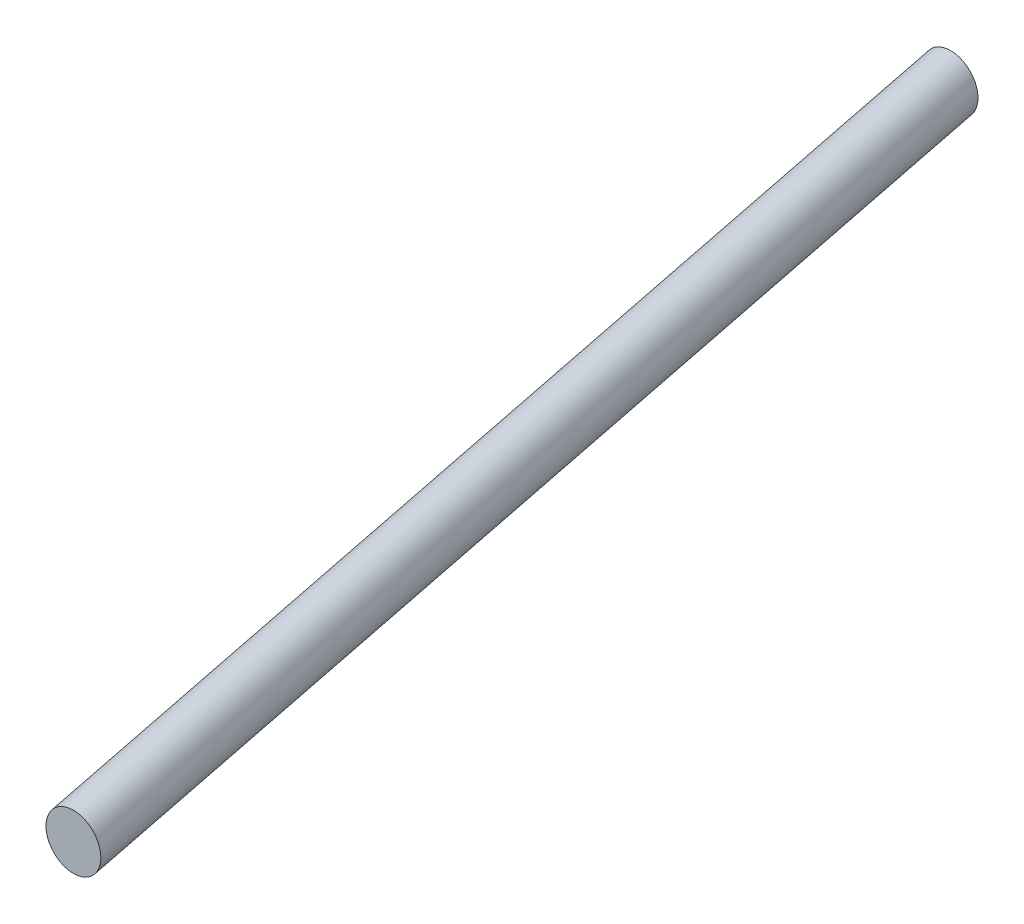
ISO-10303-21;
HEADER;
FILE_DESCRIPTION(('STEP AP214'),'2;1');
FILE_NAME('part.step','',(''),(''),'','','');
FILE_SCHEMA(('AUTOMOTIVE_DESIGN { 1 0 10303 214 1 1 1 1 }'));
ENDSEC;
DATA;
#1=APPLICATION_CONTEXT('core data for automotive mechanical design processes');
#2=APPLICATION_PROTOCOL_DEFINITION('international standard','automotive_design',2000,#1);
#3=PRODUCT_CONTEXT('',#1,'mechanical');
#4=PRODUCT('Part','Part','',(#3));
#5=PRODUCT_RELATED_PRODUCT_CATEGORY('part','',(#4));
#6=PRODUCT_DEFINITION_FORMATION('','',#4);
#7=PRODUCT_DEFINITION_CONTEXT('part definition',#1,'design');
#8=PRODUCT_DEFINITION('design','',#6,#7);
#9=PRODUCT_DEFINITION_SHAPE('','',#8);
#10=(LENGTH_UNIT() NAMED_UNIT(*) SI_UNIT(.MILLI.,.METRE.));
#11=(NAMED_UNIT(*) PLANE_ANGLE_UNIT() SI_UNIT($,.RADIAN.));
#12=(NAMED_UNIT(*) SI_UNIT($,.STERADIAN.) SOLID_ANGLE_UNIT());
#13=UNCERTAINTY_MEASURE_WITH_UNIT(LENGTH_MEASURE(1.E-05),#10,'distance_accuracy_value','');
#14=(GEOMETRIC_REPRESENTATION_CONTEXT(3) GLOBAL_UNCERTAINTY_ASSIGNED_CONTEXT((#13)) GLOBAL_UNIT_ASSIGNED_CONTEXT((#10,
#11,#12)) REPRESENTATION_CONTEXT('',''));
#15=CARTESIAN_POINT('',(0.,0.,0.));
#16=DIRECTION('',(0.,0.,1.));
#17=DIRECTION('',(1.,0.,0.));
#18=AXIS2_PLACEMENT_3D('',#15,#16,#17);
#19=CARTESIAN_POINT('',(20.,0.,100.));
#20=DIRECTION('',(0.,0.,1.));
#21=DIRECTION('',(1.,0.,0.));
#22=AXIS2_PLACEMENT_3D('',#19,#20,#21);
#23=PLANE('',#22);
#24=CARTESIAN_POINT('',(20.,0.,100.));
#25=DIRECTION('',(0.,0.,1.));
#26=DIRECTION('',(1.,0.,0.));
#27=AXIS2_PLACEMENT_3D('',#24,#25,#26);
#28=CIRCLE('',#27,2.5);
#29=CARTESIAN_POINT('',(20.0235615960829,2.49988896777237,100.));
#30=VERTEX_POINT('',#29);
#31=EDGE_CURVE('E11',#30,#30,#28,.T.);
#32=ORIENTED_EDGE('',*,*,#31,.T.);
#33=EDGE_LOOP('',(#32));
#34=FACE_BOUND('',#33,.T.);
#35=ADVANCED_FACE('F55',(#34),#23,.T.);
#36=CARTESIAN_POINT('',(0.,0.,0.));
#37=DIRECTION('',(0.,0.,1.));
#38=DIRECTION('',(1.,0.,0.));
#39=AXIS2_PLACEMENT_3D('',#36,#37,#38);
#40=PLANE('',#39);
#41=CARTESIAN_POINT('',(0.,0.,0.));
#42=DIRECTION('',(0.,0.,1.));
#43=DIRECTION('',(1.,0.,0.));
#44=AXIS2_PLACEMENT_3D('',#41,#42,#43);
#45=CIRCLE('',#44,2.5);
#46=CARTESIAN_POINT('',(-0.0298444213073158,2.49982185575629,0.));
#47=VERTEX_POINT('',#46);
#48=EDGE_CURVE('E64',#47,#47,#45,.T.);
#49=ORIENTED_EDGE('',*,*,#48,.F.);
#50=EDGE_LOOP('',(#49));
#51=FACE_BOUND('',#50,.T.);
#52=ADVANCED_FACE('F88',(#51),#40,.F.);
#53=CARTESIAN_POINT('',(-0.0298444213073158,2.49982185575629,0.));
#54=CARTESIAN_POINT('',(20.0235615960829,2.49988896777237,100.));
#55=CARTESIAN_POINT('',(-0.238162909287007,2.49733482064735,0.));
#56=CARTESIAN_POINT('',(19.8152375154352,2.50185243411261,100.));
#57=CARTESIAN_POINT('',(-0.473510359420386,2.46918995839378,0.));
#58=CARTESIAN_POINT('',(19.5793425578995,2.47874129902993,100.));
#59=CARTESIAN_POINT('',(-0.983691168713184,2.3137551287262,0.));
#60=CARTESIAN_POINT('',(19.065957884627,2.33424001289943,100.));
#61=CARTESIAN_POINT('',(-1.25950853959021,2.1851199852206,0.));
#62=CARTESIAN_POINT('',(18.7874556471185,2.2115260123739,100.));
#63=CARTESIAN_POINT('',(-1.78802876140905,1.77878167842069,0.));
#64=CARTESIAN_POINT('',(18.2503761452872,1.81657025136133,100.));
#65=CARTESIAN_POINT('',(-2.03936906036381,1.49825259573575,0.));
#66=CARTESIAN_POINT('',(17.993100757005,1.54147411053968,100.));
#67=CARTESIAN_POINT('',(-2.30996987041835,0.975953866229826,0.));
#68=CARTESIAN_POINT('',(17.7114047613867,1.0250749167968,100.));
#69=CARTESIAN_POINT('',(-2.38213450682833,0.785819808809174,0.));
#70=CARTESIAN_POINT('',(17.6351950986427,0.83652576711993,100.));
#71=CARTESIAN_POINT('',(-2.47836665174286,0.387009457336666,0.));
#72=CARTESIAN_POINT('',(17.5304658419009,0.439862049420941,100.));
#73=CARTESIAN_POINT('',(-2.50230889086523,0.178474066672376,0.));
#74=CARTESIAN_POINT('',(17.5020744985679,0.231885676730561,100.));
#75=CARTESIAN_POINT('',(-2.49733482064735,-0.238162909287006,0.));
#76=CARTESIAN_POINT('',(17.4981475658874,-0.184762484564835,100.));
#77=CARTESIAN_POINT('',(-2.46842086589654,-0.446067269978093,0.));
#78=CARTESIAN_POINT('',(17.522613835443,-0.393237043271011,100.));
#79=CARTESIAN_POINT('',(-2.36269501631052,-0.842466521851492,0.));
#80=CARTESIAN_POINT('',(17.6198479951113,-0.791804277687069,100.));
#81=CARTESIAN_POINT('',(-2.28601171905746,-1.03082354046727,0.));
#82=CARTESIAN_POINT('',(17.6924902621091,-0.981756365290363,100.));
#83=CARTESIAN_POINT('',(-2.00301876174729,-1.54651312477018,0.));
#84=CARTESIAN_POINT('',(17.9644028960321,-1.5033733519374,100.));
#85=CARTESIAN_POINT('',(-1.74505279472651,-1.82096179386837,0.));
#86=CARTESIAN_POINT('',(18.2164474469279,-1.78326986223089,100.));
#87=CARTESIAN_POINT('',(-1.20698235808933,-2.21456648091048,0.));
#88=CARTESIAN_POINT('',(18.7459872380127,-2.18827857090548,100.));
#89=CARTESIAN_POINT('',(-0.92817258656923,-2.33658014214204,0.));
#90=CARTESIAN_POINT('',(19.0221270328206,-2.31622010421526,100.));
#91=CARTESIAN_POINT('',(-0.41442636374425,-2.47979069684214,0.));
#92=CARTESIAN_POINT('',(19.5326968807477,-2.4703722201013,100.));
#93=CARTESIAN_POINT('',(-0.178474066672376,-2.50230889086523,0.));
#94=CARTESIAN_POINT('',(19.7681143232694,-2.49792550143213,100.));
#95=CARTESIAN_POINT('',(0.238162909287006,-2.49733482064735,0.));
#96=CARTESIAN_POINT('',(20.1847624845648,-2.50185243411261,100.));
#97=CARTESIAN_POINT('',(0.473510359420385,-2.46918995839378,0.));
#98=CARTESIAN_POINT('',(20.4206574421005,-2.47874129902993,100.));
#99=CARTESIAN_POINT('',(0.983691168713183,-2.3137551287262,0.));
#100=CARTESIAN_POINT('',(20.934042115373,-2.33424001289943,100.));
#101=CARTESIAN_POINT('',(1.25950853959021,-2.1851199852206,0.));
#102=CARTESIAN_POINT('',(21.2125443528815,-2.2115260123739,100.));
#103=CARTESIAN_POINT('',(1.78802876140905,-1.77878167842069,0.));
#104=CARTESIAN_POINT('',(21.7496238547128,-1.81657025136133,100.));
#105=CARTESIAN_POINT('',(2.03936906036381,-1.49825259573575,0.));
#106=CARTESIAN_POINT('',(22.006899242995,-1.54147411053968,100.));
#107=CARTESIAN_POINT('',(2.30996987041835,-0.975953866229826,0.));
#108=CARTESIAN_POINT('',(22.2885952386133,-1.0250749167968,100.));
#109=CARTESIAN_POINT('',(2.38213450682833,-0.785819808809174,0.));
#110=CARTESIAN_POINT('',(22.3648049013573,-0.836525767119931,100.));
#111=CARTESIAN_POINT('',(2.47836665174286,-0.387009457336667,0.));
#112=CARTESIAN_POINT('',(22.4695341580991,-0.439862049420942,100.));
#113=CARTESIAN_POINT('',(2.50230889086523,-0.178474066672376,0.));
#114=CARTESIAN_POINT('',(22.4979255014321,-0.231885676730561,100.));
#115=CARTESIAN_POINT('',(2.49733482064735,0.238162909287006,0.));
#116=CARTESIAN_POINT('',(22.5018524341126,0.184762484564834,100.));
#117=CARTESIAN_POINT('',(2.46842086589654,0.446067269978093,0.));
#118=CARTESIAN_POINT('',(22.477386164557,0.393237043271011,100.));
#119=CARTESIAN_POINT('',(2.36269501631052,0.842466521851492,0.));
#120=CARTESIAN_POINT('',(22.3801520048887,0.791804277687069,100.));
#121=CARTESIAN_POINT('',(2.28601171905746,1.03082354046727,0.));
#122=CARTESIAN_POINT('',(22.3075097378909,0.981756365290359,100.));
#123=CARTESIAN_POINT('',(2.00301876174729,1.54651312477018,0.));
#124=CARTESIAN_POINT('',(22.0355971039679,1.5033733519374,100.));
#125=CARTESIAN_POINT('',(1.74505279472651,1.82096179386837,0.));
#126=CARTESIAN_POINT('',(21.7835525530721,1.78326986223089,100.));
#127=CARTESIAN_POINT('',(1.20698235808933,2.21456648091048,0.));
#128=CARTESIAN_POINT('',(21.2540127619873,2.18827857090547,100.));
#129=CARTESIAN_POINT('',(0.928172586569229,2.33658014214204,0.));
#130=CARTESIAN_POINT('',(20.9778729671794,2.31622010421526,100.));
#131=CARTESIAN_POINT('',(0.414426363744251,2.47979069684214,0.));
#132=CARTESIAN_POINT('',(20.4673031192523,2.4703722201013,100.));
#133=CARTESIAN_POINT('',(0.178474066672375,2.50230889086524,0.));
#134=CARTESIAN_POINT('',(20.2318856767306,2.49792550143213,100.));
#135=CARTESIAN_POINT('',(-0.0298444213073158,2.49982185575629,0.));
#136=CARTESIAN_POINT('',(20.0235615960829,2.49988896777237,100.));
#137=B_SPLINE_SURFACE_WITH_KNOTS('',3,1,((#53,#54),(#55,#56),(#57,#58),(#59,#60),(#61,#62),(#63,
#64),(#65,#66),(#67,#68),(#69,#70),(#71,#72),(#73,#74),(#75,#76),(#77,#78),(#79,#80),(#81,#82),
(#83,#84),(#85,#86),(#87,#88),(#89,#90),(#91,#92),(#93,#94),(#95,#96),(#97,#98),(#99,#100),
(#101,#102),(#103,#104),(#105,#106),(#107,#108),(#109,#110),(#111,#112),(#113,#114),(#115,#116),
(#117,#118),(#119,#120),(#121,#122),(#123,#124),(#125,#126),(#127,#128),(#129,#130),(#131,#132),
(#133,#134),(#135,#136)),.UNSPECIFIED.,.T.,.F.,.F.,(4,2,2,2,2,2,2,2,2,2,2,2,2,2,2,2,2,2,2,2,4),
(2,2),(0.,0.0625,0.125,0.1875,0.21875,0.25,0.28125,0.3125,0.375,0.4375,0.5,0.5625,0.625,0.6875,
0.71875,0.75,0.78125,0.8125,0.875,0.9375,1.),(0.,1.),.UNSPECIFIED.);
#138=CARTESIAN_POINT('',(-0.0298444213073158,2.49982185575629,0.));
#139=CARTESIAN_POINT('',(0.179045224707165,2.49982255483979,1.04166666666666));
#140=CARTESIAN_POINT('',(0.387934870721646,2.49982325392329,2.08333333333333));
#141=CARTESIAN_POINT('',(0.805714162750608,2.49982465209029,4.16666666666667));
#142=CARTESIAN_POINT('',(1.01460380876509,2.4998253511738,5.20833333333333));
#143=CARTESIAN_POINT('',(1.43238310079405,2.4998267493408,7.29166666666667));
#144=CARTESIAN_POINT('',(1.64127274680853,2.4998274484243,8.33333333333333));
#145=CARTESIAN_POINT('',(2.05905203883749,2.4998288465913,10.4166666666667));
#146=CARTESIAN_POINT('',(2.26794168485198,2.4998295456748,11.4583333333333));
#147=CARTESIAN_POINT('',(2.68572097688094,2.4998309438418,13.5416666666667));
#148=CARTESIAN_POINT('',(2.89461062289542,2.4998316429253,14.5833333333333));
#149=CARTESIAN_POINT('',(3.31238991492438,2.49983304109231,16.6666666666667));
#150=CARTESIAN_POINT('',(3.52127956093886,2.49983374017581,17.7083333333333));
#151=CARTESIAN_POINT('',(3.93905885296782,2.49983513834281,19.7916666666667));
#152=CARTESIAN_POINT('',(4.1479484989823,2.49983583742631,20.8333333333333));
#153=CARTESIAN_POINT('',(4.56572779101127,2.49983723559331,22.9166666666667));
#154=CARTESIAN_POINT('',(4.77461743702575,2.49983793467681,23.9583333333333));
#155=CARTESIAN_POINT('',(5.19239672905471,2.49983933284381,26.0416666666667));
#156=CARTESIAN_POINT('',(5.40128637506919,2.49984003192731,27.0833333333333));
#157=CARTESIAN_POINT('',(5.81906566709815,2.49984143009432,29.1666666666667));
#158=CARTESIAN_POINT('',(6.02795531311263,2.49984212917782,30.2083333333333));
#159=CARTESIAN_POINT('',(6.4457346051416,2.49984352734482,32.2916666666667));
#160=CARTESIAN_POINT('',(6.65462425115608,2.49984422642832,33.3333333333333));
#161=CARTESIAN_POINT('',(7.07240354318504,2.49984562459532,35.4166666666667));
#162=CARTESIAN_POINT('',(7.28129318919952,2.49984632367882,36.4583333333333));
#163=CARTESIAN_POINT('',(7.69907248122848,2.49984772184582,38.5416666666667));
#164=CARTESIAN_POINT('',(7.90796212724296,2.49984842092932,39.5833333333333));
#165=CARTESIAN_POINT('',(8.32574141927192,2.49984981909633,41.6666666666667));
#166=CARTESIAN_POINT('',(8.5346310652864,2.49985051817983,42.7083333333333));
#167=CARTESIAN_POINT('',(8.95241035731537,2.49985191634683,44.7916666666667));
#168=CARTESIAN_POINT('',(9.16130000332985,2.49985261543033,45.8333333333333));
#169=CARTESIAN_POINT('',(9.57907929535881,2.49985401359733,47.9166666666667));
#170=CARTESIAN_POINT('',(9.78796894137329,2.49985471268083,48.9583333333333));
#171=CARTESIAN_POINT('',(10.2057482334023,2.49985611084783,51.0416666666667));
#172=CARTESIAN_POINT('',(10.4146378794167,2.49985680993133,52.0833333333333));
#173=CARTESIAN_POINT('',(10.8324171714457,2.49985820809834,54.1666666666667));
#174=CARTESIAN_POINT('',(11.0413068174602,2.49985890718184,55.2083333333333));
#175=CARTESIAN_POINT('',(11.4590861094891,2.49986030534884,57.2916666666667));
#176=CARTESIAN_POINT('',(11.6679757555036,2.49986100443234,58.3333333333333));
#177=CARTESIAN_POINT('',(12.0857550475326,2.49986240259934,60.4166666666667));
#178=CARTESIAN_POINT('',(12.2946446935471,2.49986310168284,61.4583333333333));
#179=CARTESIAN_POINT('',(12.712423985576,2.49986449984984,63.5416666666667));
#180=CARTESIAN_POINT('',(12.9213136315905,2.49986519893334,64.5833333333333));
#181=CARTESIAN_POINT('',(13.3390929236195,2.49986659710035,66.6666666666667));
#182=CARTESIAN_POINT('',(13.5479825696339,2.49986729618385,67.7083333333333));
#183=CARTESIAN_POINT('',(13.9657618616629,2.49986869435085,69.7916666666667));
#184=CARTESIAN_POINT('',(14.1746515076774,2.49986939343435,70.8333333333333));
#185=CARTESIAN_POINT('',(14.5924307997064,2.49987079160135,72.9166666666667));
#186=CARTESIAN_POINT('',(14.8013204457208,2.49987149068485,73.9583333333333));
#187=CARTESIAN_POINT('',(15.2190997377498,2.49987288885185,76.0416666666667));
#188=CARTESIAN_POINT('',(15.4279893837643,2.49987358793535,77.0833333333333));
#189=CARTESIAN_POINT('',(15.8457686757932,2.49987498610236,79.1666666666667));
#190=CARTESIAN_POINT('',(16.0546583218077,2.49987568518586,80.2083333333333));
#191=CARTESIAN_POINT('',(16.4724376138367,2.49987708335286,82.2916666666667));
#192=CARTESIAN_POINT('',(16.6813272598512,2.49987778243636,83.3333333333333));
#193=CARTESIAN_POINT('',(17.0991065518801,2.49987918060336,85.4166666666667));
#194=CARTESIAN_POINT('',(17.3079961978946,2.49987987968686,86.4583333333333));
#195=CARTESIAN_POINT('',(17.7257754899236,2.49988127785386,88.5416666666667));
#196=CARTESIAN_POINT('',(17.934665135938,2.49988197693736,89.5833333333333));
#197=CARTESIAN_POINT('',(18.352444427967,2.49988337510437,91.6666666666667));
#198=CARTESIAN_POINT('',(18.5613340739815,2.49988407418787,92.7083333333333));
#199=CARTESIAN_POINT('',(18.9791133660105,2.49988547235487,94.7916666666667));
#200=CARTESIAN_POINT('',(19.1880030120249,2.49988617143837,95.8333333333333));
#201=CARTESIAN_POINT('',(19.6057823040539,2.49988756960537,97.9166666666667));
#202=CARTESIAN_POINT('',(19.8146719500684,2.49988826868887,98.9583333333333));
#203=CARTESIAN_POINT('',(20.0235615960829,2.49988896777237,100.));
#204=B_SPLINE_CURVE_WITH_KNOTS('',3,(#138,#139,#140,#141,#142,#143,#144,#145,#146,#147,#148,
#149,#150,#151,#152,#153,#154,#155,#156,#157,#158,#159,#160,#161,#162,#163,#164,#165,#166,#167,
#168,#169,#170,#171,#172,#173,#174,#175,#176,#177,#178,#179,#180,#181,#182,#183,#184,#185,#186,
#187,#188,#189,#190,#191,#192,#193,#194,#195,#196,#197,#198,#199,#200,#201,#202,#203),
.UNSPECIFIED.,.F.,.F.,(4,2,2,2,2,2,2,2,2,2,2,2,2,2,2,2,2,2,2,2,2,2,2,2,2,2,2,2,2,2,2,2,4),(0.,
3.1872149218264,6.37442984365281,9.56164476547922,12.7488596873056,15.936074609132,
19.1232895309584,22.3105044527848,25.4977193746112,28.6849342964376,31.872149218264,
35.0593641400905,38.2465790619169,41.4337939837433,44.6210089055697,47.8082238273961,
50.9954387492225,54.1826536710489,57.3698685928753,60.5570835147017,63.7442984365281,
66.9315133583545,70.1187282801809,73.3059432020073,76.4931581238337,79.6803730456601,
82.8675879674865,86.0548028893129,89.2420178111393,92.4292327329657,95.6164476547921,
98.8036625766185,101.990877498445),.UNSPECIFIED.);
#205=EDGE_CURVE('BSEAM96',#47,#30,#204,.T.);
#206=ORIENTED_EDGE('',*,*,#48,.T.);
#207=ORIENTED_EDGE('',*,*,#31,.F.);
#208=ORIENTED_EDGE('',*,*,#205,.T.);
#209=ORIENTED_EDGE('',*,*,#205,.F.);
#210=EDGE_LOOP('',(#206,#208,#207,#209));
#211=FACE_BOUND('',#210,.T.);
#212=ADVANCED_FACE('F96',(#211),#137,.T.);
#213=CLOSED_SHELL('',(#35,#52,#212));
#214=MANIFOLD_SOLID_BREP('B2',#213);
#215=ADVANCED_BREP_SHAPE_REPRESENTATION('',(#18,#214),#14);
#216=SHAPE_DEFINITION_REPRESENTATION(#9,#215);
ENDSEC;
END-ISO-10303-21;
